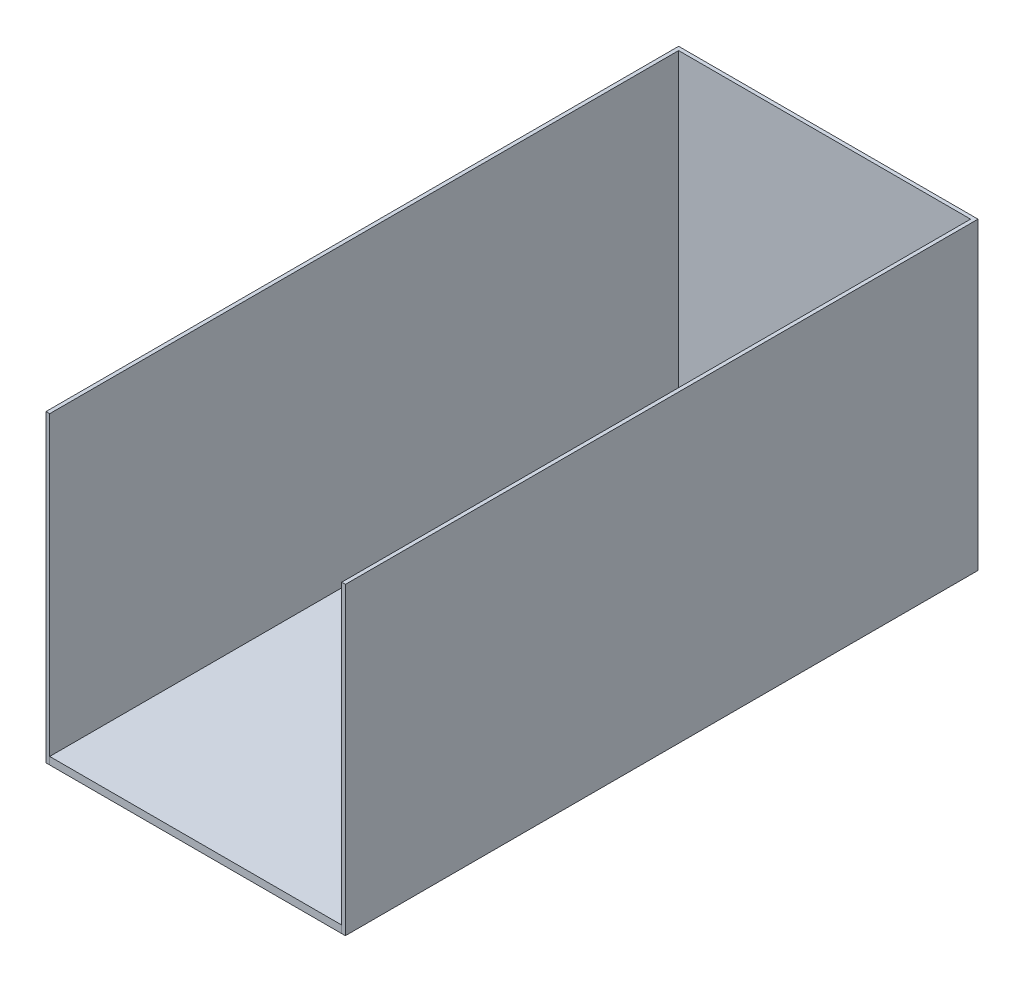
ISO-10303-21;
HEADER;
FILE_DESCRIPTION(('STEP AP214'),'2;1');
FILE_NAME('part.step','',(''),(''),'','','');
FILE_SCHEMA(('AUTOMOTIVE_DESIGN { 1 0 10303 214 1 1 1 1 }'));
ENDSEC;
DATA;
#1=APPLICATION_CONTEXT('core data for automotive mechanical design processes');
#2=APPLICATION_PROTOCOL_DEFINITION('international standard','automotive_design',2000,#1);
#3=PRODUCT_CONTEXT('',#1,'mechanical');
#4=PRODUCT('Part','Part','',(#3));
#5=PRODUCT_RELATED_PRODUCT_CATEGORY('part','',(#4));
#6=PRODUCT_DEFINITION_FORMATION('','',#4);
#7=PRODUCT_DEFINITION_CONTEXT('part definition',#1,'design');
#8=PRODUCT_DEFINITION('design','',#6,#7);
#9=PRODUCT_DEFINITION_SHAPE('','',#8);
#10=(LENGTH_UNIT() NAMED_UNIT(*) SI_UNIT(.MILLI.,.METRE.));
#11=(NAMED_UNIT(*) PLANE_ANGLE_UNIT() SI_UNIT($,.RADIAN.));
#12=(NAMED_UNIT(*) SI_UNIT($,.STERADIAN.) SOLID_ANGLE_UNIT());
#13=UNCERTAINTY_MEASURE_WITH_UNIT(LENGTH_MEASURE(1.E-05),#10,'distance_accuracy_value','');
#14=(GEOMETRIC_REPRESENTATION_CONTEXT(3) GLOBAL_UNCERTAINTY_ASSIGNED_CONTEXT((#13)) GLOBAL_UNIT_ASSIGNED_CONTEXT((#10,
#11,#12)) REPRESENTATION_CONTEXT('',''));
#15=CARTESIAN_POINT('',(0.,0.,0.));
#16=DIRECTION('',(0.,0.,1.));
#17=DIRECTION('',(1.,0.,0.));
#18=AXIS2_PLACEMENT_3D('',#15,#16,#17);
#19=CARTESIAN_POINT('',(-25.,2050.,0.));
#20=DIRECTION('',(-1.,0.,0.));
#21=DIRECTION('',(0.,0.,1.));
#22=AXIS2_PLACEMENT_3D('',#19,#20,#21);
#23=PLANE('',#22);
#24=DIRECTION('',(0.,0.,-1.));
#25=VECTOR('',#24,1.);
#26=CARTESIAN_POINT('',(-25.,0.,0.));
#27=LINE('',#26,#25);
#28=CARTESIAN_POINT('',(-25.,0.,0.));
#29=VERTEX_POINT('',#28);
#30=CARTESIAN_POINT('',(-25.,0.,-4262.));
#31=VERTEX_POINT('',#30);
#32=EDGE_CURVE('E157',#29,#31,#27,.T.);
#33=ORIENTED_EDGE('',*,*,#32,.F.);
#34=DIRECTION('',(0.,-1.,0.));
#35=VECTOR('',#34,1.);
#36=CARTESIAN_POINT('',(-25.,2050.,0.));
#37=LINE('',#36,#35);
#38=CARTESIAN_POINT('',(-25.,2050.,0.));
#39=VERTEX_POINT('',#38);
#40=EDGE_CURVE('E12',#39,#29,#37,.T.);
#41=ORIENTED_EDGE('',*,*,#40,.F.);
#42=DIRECTION('',(0.,0.,-1.));
#43=VECTOR('',#42,1.);
#44=CARTESIAN_POINT('',(-25.,2050.,0.));
#45=LINE('',#44,#43);
#46=CARTESIAN_POINT('',(-25.,2050.,-4262.));
#47=VERTEX_POINT('',#46);
#48=EDGE_CURVE('E181',#39,#47,#45,.T.);
#49=ORIENTED_EDGE('',*,*,#48,.T.);
#50=DIRECTION('',(0.,-1.,0.));
#51=VECTOR('',#50,1.);
#52=CARTESIAN_POINT('',(-25.,2050.,-4262.));
#53=LINE('',#52,#51);
#54=EDGE_CURVE('E74',#47,#31,#53,.T.);
#55=ORIENTED_EDGE('',*,*,#54,.T.);
#56=EDGE_LOOP('',(#33,#41,#49,#55));
#57=FACE_BOUND('',#56,.T.);
#58=ADVANCED_FACE('F57',(#57),#23,.T.);
#59=CARTESIAN_POINT('',(0.,2050.,0.));
#60=DIRECTION('',(0.,0.,-1.));
#61=DIRECTION('',(-1.,0.,0.));
#62=AXIS2_PLACEMENT_3D('',#59,#60,#61);
#63=PLANE('',#62);
#64=DIRECTION('',(1.,0.,0.));
#65=VECTOR('',#64,1.);
#66=CARTESIAN_POINT('',(0.,0.,0.));
#67=LINE('',#66,#65);
#68=CARTESIAN_POINT('',(0.,0.,0.));
#69=VERTEX_POINT('',#68);
#70=EDGE_CURVE('E160',#29,#69,#67,.T.);
#71=ORIENTED_EDGE('',*,*,#70,.T.);
#72=DIRECTION('',(0.,-1.,0.));
#73=VECTOR('',#72,1.);
#74=CARTESIAN_POINT('',(0.,2050.,0.));
#75=LINE('',#74,#73);
#76=CARTESIAN_POINT('',(0.,2050.,0.));
#77=VERTEX_POINT('',#76);
#78=EDGE_CURVE('E66',#77,#69,#75,.T.);
#79=ORIENTED_EDGE('',*,*,#78,.F.);
#80=DIRECTION('',(1.,0.,0.));
#81=VECTOR('',#80,1.);
#82=CARTESIAN_POINT('',(0.,2050.,0.));
#83=LINE('',#82,#81);
#84=EDGE_CURVE('E137',#39,#77,#83,.T.);
#85=ORIENTED_EDGE('',*,*,#84,.F.);
#86=ORIENTED_EDGE('',*,*,#40,.T.);
#87=EDGE_LOOP('',(#71,#79,#85,#86));
#88=FACE_BOUND('',#87,.T.);
#89=ADVANCED_FACE('F232',(#88),#63,.F.);
#90=CARTESIAN_POINT('',(0.,2050.,0.));
#91=DIRECTION('',(-1.,0.,0.));
#92=DIRECTION('',(0.,0.,1.));
#93=AXIS2_PLACEMENT_3D('',#90,#91,#92);
#94=PLANE('',#93);
#95=DIRECTION('',(0.,0.,-1.));
#96=VECTOR('',#95,1.);
#97=CARTESIAN_POINT('',(0.,0.,0.));
#98=LINE('',#97,#96);
#99=CARTESIAN_POINT('',(0.,0.,-4237.));
#100=VERTEX_POINT('',#99);
#101=EDGE_CURVE('E163',#69,#100,#98,.T.);
#102=ORIENTED_EDGE('',*,*,#101,.T.);
#103=DIRECTION('',(0.,-1.,0.));
#104=VECTOR('',#103,1.);
#105=CARTESIAN_POINT('',(0.,2050.,-4237.));
#106=LINE('',#105,#104);
#107=CARTESIAN_POINT('',(0.,2050.,-4237.));
#108=VERTEX_POINT('',#107);
#109=EDGE_CURVE('E191',#108,#100,#106,.T.);
#110=ORIENTED_EDGE('',*,*,#109,.F.);
#111=DIRECTION('',(0.,0.,-1.));
#112=VECTOR('',#111,1.);
#113=CARTESIAN_POINT('',(0.,2050.,0.));
#114=LINE('',#113,#112);
#115=EDGE_CURVE('E202',#77,#108,#114,.T.);
#116=ORIENTED_EDGE('',*,*,#115,.F.);
#117=ORIENTED_EDGE('',*,*,#78,.T.);
#118=EDGE_LOOP('',(#102,#110,#116,#117));
#119=FACE_BOUND('',#118,.T.);
#120=ADVANCED_FACE('F200',(#119),#94,.F.);
#121=CARTESIAN_POINT('',(0.,2050.,-4237.));
#122=DIRECTION('',(0.,0.,-1.));
#123=DIRECTION('',(-1.,0.,0.));
#124=AXIS2_PLACEMENT_3D('',#121,#122,#123);
#125=PLANE('',#124);
#126=DIRECTION('',(1.,0.,0.));
#127=VECTOR('',#126,1.);
#128=CARTESIAN_POINT('',(0.,0.,-4237.));
#129=LINE('',#128,#127);
#130=CARTESIAN_POINT('',(1967.,0.,-4237.));
#131=VERTEX_POINT('',#130);
#132=EDGE_CURVE('E166',#100,#131,#129,.T.);
#133=ORIENTED_EDGE('',*,*,#132,.T.);
#134=DIRECTION('',(0.,-1.,0.));
#135=VECTOR('',#134,1.);
#136=CARTESIAN_POINT('',(1967.,2050.,-4237.));
#137=LINE('',#136,#135);
#138=CARTESIAN_POINT('',(1967.,2050.,-4237.));
#139=VERTEX_POINT('',#138);
#140=EDGE_CURVE('E188',#139,#131,#137,.T.);
#141=ORIENTED_EDGE('',*,*,#140,.F.);
#142=DIRECTION('',(1.,0.,0.));
#143=VECTOR('',#142,1.);
#144=CARTESIAN_POINT('',(0.,2050.,-4237.));
#145=LINE('',#144,#143);
#146=EDGE_CURVE('E213',#108,#139,#145,.T.);
#147=ORIENTED_EDGE('',*,*,#146,.F.);
#148=ORIENTED_EDGE('',*,*,#109,.T.);
#149=EDGE_LOOP('',(#133,#141,#147,#148));
#150=FACE_BOUND('',#149,.T.);
#151=ADVANCED_FACE('F211',(#150),#125,.F.);
#152=CARTESIAN_POINT('',(1967.,2050.,0.));
#153=DIRECTION('',(-1.,0.,0.));
#154=DIRECTION('',(0.,0.,1.));
#155=AXIS2_PLACEMENT_3D('',#152,#153,#154);
#156=PLANE('',#155);
#157=DIRECTION('',(0.,0.,-1.));
#158=VECTOR('',#157,1.);
#159=CARTESIAN_POINT('',(1967.,0.,0.));
#160=LINE('',#159,#158);
#161=CARTESIAN_POINT('',(1967.,0.,0.));
#162=VERTEX_POINT('',#161);
#163=EDGE_CURVE('E170',#162,#131,#160,.T.);
#164=ORIENTED_EDGE('',*,*,#163,.F.);
#165=DIRECTION('',(0.,-1.,0.));
#166=VECTOR('',#165,1.);
#167=CARTESIAN_POINT('',(1967.,2050.,0.));
#168=LINE('',#167,#166);
#169=CARTESIAN_POINT('',(1967.,2050.,0.));
#170=VERTEX_POINT('',#169);
#171=EDGE_CURVE('E146',#170,#162,#168,.T.);
#172=ORIENTED_EDGE('',*,*,#171,.F.);
#173=DIRECTION('',(0.,0.,-1.));
#174=VECTOR('',#173,1.);
#175=CARTESIAN_POINT('',(1967.,2050.,0.));
#176=LINE('',#175,#174);
#177=EDGE_CURVE('E133',#170,#139,#176,.T.);
#178=ORIENTED_EDGE('',*,*,#177,.T.);
#179=ORIENTED_EDGE('',*,*,#140,.T.);
#180=EDGE_LOOP('',(#164,#172,#178,#179));
#181=FACE_BOUND('',#180,.T.);
#182=ADVANCED_FACE('F242',(#181),#156,.T.);
#183=CARTESIAN_POINT('',(1992.,0.,0.));
#184=VERTEX_POINT('',#183);
#185=EDGE_CURVE('E142',#162,#184,#67,.T.);
#186=ORIENTED_EDGE('',*,*,#185,.T.);
#187=DIRECTION('',(0.,-1.,0.));
#188=VECTOR('',#187,1.);
#189=CARTESIAN_POINT('',(1992.,2050.,0.));
#190=LINE('',#189,#188);
#191=CARTESIAN_POINT('',(1992.,2050.,0.));
#192=VERTEX_POINT('',#191);
#193=EDGE_CURVE('E139',#192,#184,#190,.T.);
#194=ORIENTED_EDGE('',*,*,#193,.F.);
#195=EDGE_CURVE('E125',#170,#192,#83,.T.);
#196=ORIENTED_EDGE('',*,*,#195,.F.);
#197=ORIENTED_EDGE('',*,*,#171,.T.);
#198=EDGE_LOOP('',(#186,#194,#196,#197));
#199=FACE_BOUND('',#198,.T.);
#200=ADVANCED_FACE('F140',(#199),#63,.F.);
#201=CARTESIAN_POINT('',(1992.,2050.,0.));
#202=DIRECTION('',(-1.,0.,0.));
#203=DIRECTION('',(0.,0.,1.));
#204=AXIS2_PLACEMENT_3D('',#201,#202,#203);
#205=PLANE('',#204);
#206=DIRECTION('',(0.,0.,-1.));
#207=VECTOR('',#206,1.);
#208=CARTESIAN_POINT('',(1992.,0.,0.));
#209=LINE('',#208,#207);
#210=CARTESIAN_POINT('',(1992.,0.,-4262.));
#211=VERTEX_POINT('',#210);
#212=EDGE_CURVE('E174',#184,#211,#209,.T.);
#213=ORIENTED_EDGE('',*,*,#212,.T.);
#214=DIRECTION('',(0.,-1.,0.));
#215=VECTOR('',#214,1.);
#216=CARTESIAN_POINT('',(1992.,2050.,-4262.));
#217=LINE('',#216,#215);
#218=CARTESIAN_POINT('',(1992.,2050.,-4262.));
#219=VERTEX_POINT('',#218);
#220=EDGE_CURVE('E100',#219,#211,#217,.T.);
#221=ORIENTED_EDGE('',*,*,#220,.F.);
#222=DIRECTION('',(0.,0.,-1.));
#223=VECTOR('',#222,1.);
#224=CARTESIAN_POINT('',(1992.,2050.,0.));
#225=LINE('',#224,#223);
#226=EDGE_CURVE('E131',#192,#219,#225,.T.);
#227=ORIENTED_EDGE('',*,*,#226,.F.);
#228=ORIENTED_EDGE('',*,*,#193,.T.);
#229=EDGE_LOOP('',(#213,#221,#227,#228));
#230=FACE_BOUND('',#229,.T.);
#231=ADVANCED_FACE('F148',(#230),#205,.F.);
#232=CARTESIAN_POINT('',(0.,2050.,-4262.));
#233=DIRECTION('',(0.,0.,-1.));
#234=DIRECTION('',(-1.,0.,0.));
#235=AXIS2_PLACEMENT_3D('',#232,#233,#234);
#236=PLANE('',#235);
#237=DIRECTION('',(1.,0.,0.));
#238=VECTOR('',#237,1.);
#239=CARTESIAN_POINT('',(0.,0.,-4262.));
#240=LINE('',#239,#238);
#241=EDGE_CURVE('E177',#31,#211,#240,.T.);
#242=ORIENTED_EDGE('',*,*,#241,.F.);
#243=ORIENTED_EDGE('',*,*,#54,.F.);
#244=DIRECTION('',(1.,0.,0.));
#245=VECTOR('',#244,1.);
#246=CARTESIAN_POINT('',(0.,2050.,-4262.));
#247=LINE('',#246,#245);
#248=EDGE_CURVE('E150',#47,#219,#247,.T.);
#249=ORIENTED_EDGE('',*,*,#248,.T.);
#250=ORIENTED_EDGE('',*,*,#220,.T.);
#251=EDGE_LOOP('',(#242,#243,#249,#250));
#252=FACE_BOUND('',#251,.T.);
#253=ADVANCED_FACE('F221',(#252),#236,.T.);
#254=CARTESIAN_POINT('',(0.,2050.,0.));
#255=DIRECTION('',(0.,1.,0.));
#256=DIRECTION('',(0.,0.,1.));
#257=AXIS2_PLACEMENT_3D('',#254,#255,#256);
#258=PLANE('',#257);
#259=ORIENTED_EDGE('',*,*,#48,.F.);
#260=ORIENTED_EDGE('',*,*,#84,.T.);
#261=ORIENTED_EDGE('',*,*,#115,.T.);
#262=ORIENTED_EDGE('',*,*,#146,.T.);
#263=ORIENTED_EDGE('',*,*,#177,.F.);
#264=ORIENTED_EDGE('',*,*,#195,.T.);
#265=ORIENTED_EDGE('',*,*,#226,.T.);
#266=ORIENTED_EDGE('',*,*,#248,.F.);
#267=EDGE_LOOP('',(#259,#260,#261,#262,#263,#264,#265,#266));
#268=FACE_BOUND('',#267,.T.);
#269=ADVANCED_FACE('F128',(#268),#258,.T.);
#270=CARTESIAN_POINT('',(0.,0.,0.));
#271=DIRECTION('',(0.,1.,0.));
#272=DIRECTION('',(0.,0.,1.));
#273=AXIS2_PLACEMENT_3D('',#270,#271,#272);
#274=PLANE('',#273);
#275=ORIENTED_EDGE('',*,*,#32,.T.);
#276=ORIENTED_EDGE('',*,*,#241,.T.);
#277=ORIENTED_EDGE('',*,*,#212,.F.);
#278=ORIENTED_EDGE('',*,*,#185,.F.);
#279=ORIENTED_EDGE('',*,*,#163,.T.);
#280=ORIENTED_EDGE('',*,*,#132,.F.);
#281=ORIENTED_EDGE('',*,*,#101,.F.);
#282=ORIENTED_EDGE('',*,*,#70,.F.);
#283=EDGE_LOOP('',(#275,#276,#277,#278,#279,#280,#281,#282));
#284=FACE_BOUND('',#283,.T.);
#285=ADVANCED_FACE('F207',(#284),#274,.F.);
#286=CLOSED_SHELL('',(#58,#89,#120,#151,#182,#200,#231,#253,#269,#285));
#287=MANIFOLD_SOLID_BREP('B2',#286);
#288=CARTESIAN_POINT('',(0.,50.,-4237.));
#289=DIRECTION('',(0.,0.,-1.));
#290=DIRECTION('',(-1.,0.,0.));
#291=AXIS2_PLACEMENT_3D('',#288,#289,#290);
#292=PLANE('',#291);
#293=DIRECTION('',(1.,0.,0.));
#294=VECTOR('',#293,1.);
#295=CARTESIAN_POINT('',(0.,0.,-4237.));
#296=LINE('',#295,#294);
#297=CARTESIAN_POINT('',(0.,0.,-4237.));
#298=VERTEX_POINT('',#297);
#299=CARTESIAN_POINT('',(1967.,0.,-4237.));
#300=VERTEX_POINT('',#299);
#301=EDGE_CURVE('E370',#298,#300,#296,.T.);
#302=ORIENTED_EDGE('',*,*,#301,.F.);
#303=DIRECTION('',(0.,-1.,0.));
#304=VECTOR('',#303,1.);
#305=CARTESIAN_POINT('',(0.,50.,-4237.));
#306=LINE('',#305,#304);
#307=CARTESIAN_POINT('',(0.,50.,-4237.));
#308=VERTEX_POINT('',#307);
#309=EDGE_CURVE('E55',#308,#298,#306,.T.);
#310=ORIENTED_EDGE('',*,*,#309,.F.);
#311=DIRECTION('',(1.,0.,0.));
#312=VECTOR('',#311,1.);
#313=CARTESIAN_POINT('',(0.,50.,-4237.));
#314=LINE('',#313,#312);
#315=CARTESIAN_POINT('',(1967.,50.,-4237.));
#316=VERTEX_POINT('',#315);
#317=EDGE_CURVE('E364',#308,#316,#314,.T.);
#318=ORIENTED_EDGE('',*,*,#317,.T.);
#319=DIRECTION('',(0.,-1.,0.));
#320=VECTOR('',#319,1.);
#321=CARTESIAN_POINT('',(1967.,50.,-4237.));
#322=LINE('',#321,#320);
#323=EDGE_CURVE('E309',#316,#300,#322,.T.);
#324=ORIENTED_EDGE('',*,*,#323,.T.);
#325=EDGE_LOOP('',(#302,#310,#318,#324));
#326=FACE_BOUND('',#325,.T.);
#327=ADVANCED_FACE('F306',(#326),#292,.T.);
#328=CARTESIAN_POINT('',(0.,50.,0.));
#329=DIRECTION('',(-1.,0.,0.));
#330=DIRECTION('',(0.,0.,1.));
#331=AXIS2_PLACEMENT_3D('',#328,#329,#330);
#332=PLANE('',#331);
#333=DIRECTION('',(0.,0.,-1.));
#334=VECTOR('',#333,1.);
#335=CARTESIAN_POINT('',(0.,0.,0.));
#336=LINE('',#335,#334);
#337=CARTESIAN_POINT('',(0.,0.,0.));
#338=VERTEX_POINT('',#337);
#339=EDGE_CURVE('E366',#338,#298,#336,.T.);
#340=ORIENTED_EDGE('',*,*,#339,.F.);
#341=DIRECTION('',(0.,-1.,0.));
#342=VECTOR('',#341,1.);
#343=CARTESIAN_POINT('',(0.,50.,0.));
#344=LINE('',#343,#342);
#345=CARTESIAN_POINT('',(0.,50.,0.));
#346=VERTEX_POINT('',#345);
#347=EDGE_CURVE('E315',#346,#338,#344,.T.);
#348=ORIENTED_EDGE('',*,*,#347,.F.);
#349=DIRECTION('',(0.,0.,-1.));
#350=VECTOR('',#349,1.);
#351=CARTESIAN_POINT('',(0.,50.,0.));
#352=LINE('',#351,#350);
#353=EDGE_CURVE('E354',#346,#308,#352,.T.);
#354=ORIENTED_EDGE('',*,*,#353,.T.);
#355=ORIENTED_EDGE('',*,*,#309,.T.);
#356=EDGE_LOOP('',(#340,#348,#354,#355));
#357=FACE_BOUND('',#356,.T.);
#358=ADVANCED_FACE('F380',(#357),#332,.T.);
#359=CARTESIAN_POINT('',(0.,50.,0.));
#360=DIRECTION('',(0.,0.,-1.));
#361=DIRECTION('',(-1.,0.,0.));
#362=AXIS2_PLACEMENT_3D('',#359,#360,#361);
#363=PLANE('',#362);
#364=DIRECTION('',(1.,0.,0.));
#365=VECTOR('',#364,1.);
#366=CARTESIAN_POINT('',(0.,0.,0.));
#367=LINE('',#366,#365);
#368=CARTESIAN_POINT('',(1967.,0.,0.));
#369=VERTEX_POINT('',#368);
#370=EDGE_CURVE('E359',#338,#369,#367,.T.);
#371=ORIENTED_EDGE('',*,*,#370,.T.);
#372=DIRECTION('',(0.,-1.,0.));
#373=VECTOR('',#372,1.);
#374=CARTESIAN_POINT('',(1967.,50.,0.));
#375=LINE('',#374,#373);
#376=CARTESIAN_POINT('',(1967.,50.,0.));
#377=VERTEX_POINT('',#376);
#378=EDGE_CURVE('E357',#377,#369,#375,.T.);
#379=ORIENTED_EDGE('',*,*,#378,.F.);
#380=DIRECTION('',(1.,0.,0.));
#381=VECTOR('',#380,1.);
#382=CARTESIAN_POINT('',(0.,50.,0.));
#383=LINE('',#382,#381);
#384=EDGE_CURVE('E351',#346,#377,#383,.T.);
#385=ORIENTED_EDGE('',*,*,#384,.F.);
#386=ORIENTED_EDGE('',*,*,#347,.T.);
#387=EDGE_LOOP('',(#371,#379,#385,#386));
#388=FACE_BOUND('',#387,.T.);
#389=ADVANCED_FACE('F358',(#388),#363,.F.);
#390=CARTESIAN_POINT('',(1967.,50.,0.));
#391=DIRECTION('',(-1.,0.,0.));
#392=DIRECTION('',(0.,0.,1.));
#393=AXIS2_PLACEMENT_3D('',#390,#391,#392);
#394=PLANE('',#393);
#395=DIRECTION('',(0.,0.,-1.));
#396=VECTOR('',#395,1.);
#397=CARTESIAN_POINT('',(1967.,0.,0.));
#398=LINE('',#397,#396);
#399=EDGE_CURVE('E373',#369,#300,#398,.T.);
#400=ORIENTED_EDGE('',*,*,#399,.T.);
#401=ORIENTED_EDGE('',*,*,#323,.F.);
#402=DIRECTION('',(0.,0.,-1.));
#403=VECTOR('',#402,1.);
#404=CARTESIAN_POINT('',(1967.,50.,0.));
#405=LINE('',#404,#403);
#406=EDGE_CURVE('E348',#377,#316,#405,.T.);
#407=ORIENTED_EDGE('',*,*,#406,.F.);
#408=ORIENTED_EDGE('',*,*,#378,.T.);
#409=EDGE_LOOP('',(#400,#401,#407,#408));
#410=FACE_BOUND('',#409,.T.);
#411=ADVANCED_FACE('F363',(#410),#394,.F.);
#412=CARTESIAN_POINT('',(0.,50.,0.));
#413=DIRECTION('',(0.,1.,0.));
#414=DIRECTION('',(0.,0.,1.));
#415=AXIS2_PLACEMENT_3D('',#412,#413,#414);
#416=PLANE('',#415);
#417=ORIENTED_EDGE('',*,*,#317,.F.);
#418=ORIENTED_EDGE('',*,*,#353,.F.);
#419=ORIENTED_EDGE('',*,*,#384,.T.);
#420=ORIENTED_EDGE('',*,*,#406,.T.);
#421=EDGE_LOOP('',(#417,#418,#419,#420));
#422=FACE_BOUND('',#421,.T.);
#423=ADVANCED_FACE('F353',(#422),#416,.T.);
#424=CARTESIAN_POINT('',(0.,0.,0.));
#425=DIRECTION('',(0.,1.,0.));
#426=DIRECTION('',(0.,0.,1.));
#427=AXIS2_PLACEMENT_3D('',#424,#425,#426);
#428=PLANE('',#427);
#429=ORIENTED_EDGE('',*,*,#301,.T.);
#430=ORIENTED_EDGE('',*,*,#399,.F.);
#431=ORIENTED_EDGE('',*,*,#370,.F.);
#432=ORIENTED_EDGE('',*,*,#339,.T.);
#433=EDGE_LOOP('',(#429,#430,#431,#432));
#434=FACE_BOUND('',#433,.T.);
#435=ADVANCED_FACE('F379',(#434),#428,.F.);
#436=CLOSED_SHELL('',(#327,#358,#389,#411,#423,#435));
#437=MANIFOLD_SOLID_BREP('B6',#436);
#438=ADVANCED_BREP_SHAPE_REPRESENTATION('',(#18,#287,#437),#14);
#439=SHAPE_DEFINITION_REPRESENTATION(#9,#438);
ENDSEC;
END-ISO-10303-21;
